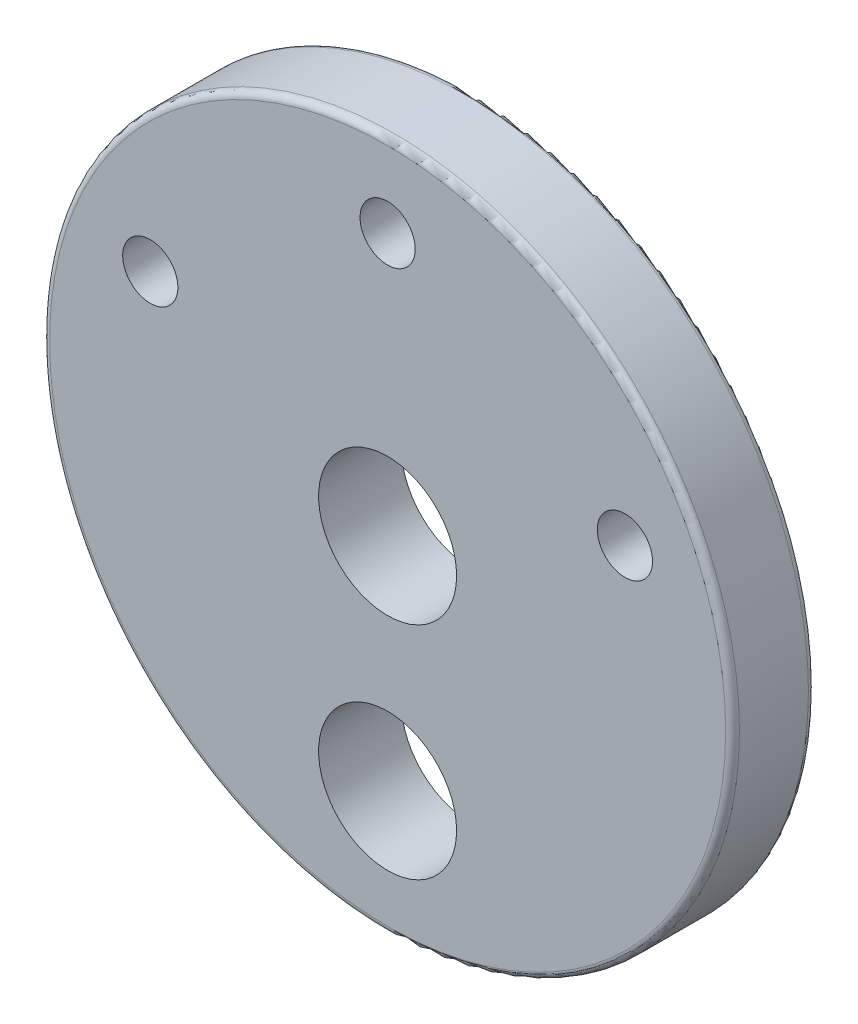
ISO-10303-21;
HEADER;
FILE_DESCRIPTION(('STEP AP214'),'2;1');
FILE_NAME('part.step','',(''),(''),'','','');
FILE_SCHEMA(('AUTOMOTIVE_DESIGN { 1 0 10303 214 1 1 1 1 }'));
ENDSEC;
DATA;
#1=APPLICATION_CONTEXT('core data for automotive mechanical design processes');
#2=APPLICATION_PROTOCOL_DEFINITION('international standard','automotive_design',2000,#1);
#3=PRODUCT_CONTEXT('',#1,'mechanical');
#4=PRODUCT('Part','Part','',(#3));
#5=PRODUCT_RELATED_PRODUCT_CATEGORY('part','',(#4));
#6=PRODUCT_DEFINITION_FORMATION('','',#4);
#7=PRODUCT_DEFINITION_CONTEXT('part definition',#1,'design');
#8=PRODUCT_DEFINITION('design','',#6,#7);
#9=PRODUCT_DEFINITION_SHAPE('','',#8);
#10=(LENGTH_UNIT() NAMED_UNIT(*) SI_UNIT(.MILLI.,.METRE.));
#11=(NAMED_UNIT(*) PLANE_ANGLE_UNIT() SI_UNIT($,.RADIAN.));
#12=(NAMED_UNIT(*) SI_UNIT($,.STERADIAN.) SOLID_ANGLE_UNIT());
#13=UNCERTAINTY_MEASURE_WITH_UNIT(LENGTH_MEASURE(1.E-05),#10,'distance_accuracy_value','');
#14=(GEOMETRIC_REPRESENTATION_CONTEXT(3) GLOBAL_UNCERTAINTY_ASSIGNED_CONTEXT((#13)) GLOBAL_UNIT_ASSIGNED_CONTEXT((#10,
#11,#12)) REPRESENTATION_CONTEXT('',''));
#15=CARTESIAN_POINT('',(0.,0.,0.));
#16=DIRECTION('',(0.,0.,1.));
#17=DIRECTION('',(1.,0.,0.));
#18=AXIS2_PLACEMENT_3D('',#15,#16,#17);
#19=CARTESIAN_POINT('',(0.,0.,3.));
#20=DIRECTION('',(0.,0.,-1.));
#21=DIRECTION('',(-1.,0.,0.));
#22=AXIS2_PLACEMENT_3D('',#19,#20,#21);
#23=CYLINDRICAL_SURFACE('',#22,12.5);
#24=CARTESIAN_POINT('',(0.,0.,0.25));
#25=DIRECTION('',(0.,0.,1.));
#26=DIRECTION('',(1.,0.,0.));
#27=AXIS2_PLACEMENT_3D('',#24,#25,#26);
#28=CIRCLE('',#27,12.5);
#29=CARTESIAN_POINT('',(12.5,0.,0.25));
#30=VERTEX_POINT('',#29);
#31=EDGE_CURVE('E43',#30,#30,#28,.T.);
#32=ORIENTED_EDGE('',*,*,#31,.T.);
#33=EDGE_LOOP('',(#32));
#34=FACE_BOUND('',#33,.T.);
#35=CARTESIAN_POINT('',(0.,0.,2.75));
#36=DIRECTION('',(0.,0.,1.));
#37=DIRECTION('',(1.,0.,0.));
#38=AXIS2_PLACEMENT_3D('',#35,#36,#37);
#39=CIRCLE('',#38,12.5);
#40=CARTESIAN_POINT('',(12.5,0.,2.75));
#41=VERTEX_POINT('',#40);
#42=EDGE_CURVE('E47',#41,#41,#39,.F.);
#43=ORIENTED_EDGE('',*,*,#42,.T.);
#44=EDGE_LOOP('',(#43));
#45=FACE_BOUND('',#44,.T.);
#46=ADVANCED_FACE('F32',(#34,#45),#23,.T.);
#47=CARTESIAN_POINT('',(0.,0.,3.));
#48=DIRECTION('',(0.,0.,1.));
#49=DIRECTION('',(1.,0.,0.));
#50=AXIS2_PLACEMENT_3D('',#47,#48,#49);
#51=PLANE('',#50);
#52=CARTESIAN_POINT('',(0.,0.,3.));
#53=DIRECTION('',(0.,0.,1.));
#54=DIRECTION('',(1.,0.,0.));
#55=AXIS2_PLACEMENT_3D('',#52,#53,#54);
#56=CIRCLE('',#55,12.25);
#57=CARTESIAN_POINT('',(12.25,0.,3.));
#58=VERTEX_POINT('',#57);
#59=EDGE_CURVE('E10',#58,#58,#56,.T.);
#60=ORIENTED_EDGE('',*,*,#59,.T.);
#61=EDGE_LOOP('',(#60));
#62=FACE_BOUND('',#61,.T.);
#63=CARTESIAN_POINT('',(0.,-8.,3.));
#64=DIRECTION('',(0.,0.,1.));
#65=DIRECTION('',(1.,0.,0.));
#66=AXIS2_PLACEMENT_3D('',#63,#64,#65);
#67=CIRCLE('',#66,2.5);
#68=CARTESIAN_POINT('',(2.5,-8.,3.));
#69=VERTEX_POINT('',#68);
#70=EDGE_CURVE('E66',#69,#69,#67,.T.);
#71=ORIENTED_EDGE('',*,*,#70,.F.);
#72=EDGE_LOOP('',(#71));
#73=FACE_BOUND('',#72,.T.);
#74=CARTESIAN_POINT('',(0.,9.5,3.));
#75=DIRECTION('',(0.,0.,1.));
#76=DIRECTION('',(1.,0.,0.));
#77=AXIS2_PLACEMENT_3D('',#74,#75,#76);
#78=CIRCLE('',#77,1.);
#79=CARTESIAN_POINT('',(1.,9.5,3.));
#80=VERTEX_POINT('',#79);
#81=EDGE_CURVE('E59',#80,#80,#78,.T.);
#82=ORIENTED_EDGE('',*,*,#81,.F.);
#83=EDGE_LOOP('',(#82));
#84=FACE_BOUND('',#83,.T.);
#85=CARTESIAN_POINT('',(8.6,4.,3.));
#86=DIRECTION('',(0.,0.,1.));
#87=DIRECTION('',(1.,0.,0.));
#88=AXIS2_PLACEMENT_3D('',#85,#86,#87);
#89=CIRCLE('',#88,1.);
#90=CARTESIAN_POINT('',(9.6,4.,3.));
#91=VERTEX_POINT('',#90);
#92=EDGE_CURVE('E77',#91,#91,#89,.T.);
#93=ORIENTED_EDGE('',*,*,#92,.F.);
#94=EDGE_LOOP('',(#93));
#95=FACE_BOUND('',#94,.T.);
#96=CARTESIAN_POINT('',(-8.6,4.,3.));
#97=DIRECTION('',(0.,0.,1.));
#98=DIRECTION('',(1.,0.,0.));
#99=AXIS2_PLACEMENT_3D('',#96,#97,#98);
#100=CIRCLE('',#99,1.);
#101=CARTESIAN_POINT('',(-7.6,4.,3.));
#102=VERTEX_POINT('',#101);
#103=EDGE_CURVE('E71',#102,#102,#100,.T.);
#104=ORIENTED_EDGE('',*,*,#103,.F.);
#105=EDGE_LOOP('',(#104));
#106=FACE_BOUND('',#105,.T.);
#107=CARTESIAN_POINT('',(0.,0.,3.));
#108=DIRECTION('',(0.,0.,1.));
#109=DIRECTION('',(1.,0.,0.));
#110=AXIS2_PLACEMENT_3D('',#107,#108,#109);
#111=CIRCLE('',#110,2.5);
#112=CARTESIAN_POINT('',(2.5,0.,3.));
#113=VERTEX_POINT('',#112);
#114=EDGE_CURVE('E53',#113,#113,#111,.T.);
#115=ORIENTED_EDGE('',*,*,#114,.F.);
#116=EDGE_LOOP('',(#115));
#117=FACE_BOUND('',#116,.T.);
#118=ADVANCED_FACE('F94',(#62,#73,#84,#95,#106,#117),#51,.T.);
#119=CARTESIAN_POINT('',(0.,0.,0.));
#120=DIRECTION('',(0.,0.,1.));
#121=DIRECTION('',(1.,0.,0.));
#122=AXIS2_PLACEMENT_3D('',#119,#120,#121);
#123=PLANE('',#122);
#124=CARTESIAN_POINT('',(0.,0.,0.));
#125=DIRECTION('',(0.,0.,1.));
#126=DIRECTION('',(1.,0.,0.));
#127=AXIS2_PLACEMENT_3D('',#124,#125,#126);
#128=CIRCLE('',#127,12.25);
#129=CARTESIAN_POINT('',(12.25,0.,0.));
#130=VERTEX_POINT('',#129);
#131=EDGE_CURVE('E39',#130,#130,#128,.F.);
#132=ORIENTED_EDGE('',*,*,#131,.T.);
#133=EDGE_LOOP('',(#132));
#134=FACE_BOUND('',#133,.T.);
#135=CARTESIAN_POINT('',(0.,-8.,0.));
#136=DIRECTION('',(0.,0.,1.));
#137=DIRECTION('',(1.,0.,0.));
#138=AXIS2_PLACEMENT_3D('',#135,#136,#137);
#139=CIRCLE('',#138,2.5);
#140=CARTESIAN_POINT('',(2.5,-8.,0.));
#141=VERTEX_POINT('',#140);
#142=EDGE_CURVE('E56',#141,#141,#139,.T.);
#143=ORIENTED_EDGE('',*,*,#142,.T.);
#144=EDGE_LOOP('',(#143));
#145=FACE_BOUND('',#144,.T.);
#146=CARTESIAN_POINT('',(0.,9.5,0.));
#147=DIRECTION('',(0.,0.,1.));
#148=DIRECTION('',(1.,0.,0.));
#149=AXIS2_PLACEMENT_3D('',#146,#147,#148);
#150=CIRCLE('',#149,1.);
#151=CARTESIAN_POINT('',(1.,9.5,0.));
#152=VERTEX_POINT('',#151);
#153=EDGE_CURVE('E62',#152,#152,#150,.T.);
#154=ORIENTED_EDGE('',*,*,#153,.T.);
#155=EDGE_LOOP('',(#154));
#156=FACE_BOUND('',#155,.T.);
#157=CARTESIAN_POINT('',(8.6,4.,0.));
#158=DIRECTION('',(0.,0.,1.));
#159=DIRECTION('',(1.,0.,0.));
#160=AXIS2_PLACEMENT_3D('',#157,#158,#159);
#161=CIRCLE('',#160,1.);
#162=CARTESIAN_POINT('',(9.6,4.,0.));
#163=VERTEX_POINT('',#162);
#164=EDGE_CURVE('E63',#163,#163,#161,.T.);
#165=ORIENTED_EDGE('',*,*,#164,.T.);
#166=EDGE_LOOP('',(#165));
#167=FACE_BOUND('',#166,.T.);
#168=CARTESIAN_POINT('',(-8.6,4.,0.));
#169=DIRECTION('',(0.,0.,1.));
#170=DIRECTION('',(1.,0.,0.));
#171=AXIS2_PLACEMENT_3D('',#168,#169,#170);
#172=CIRCLE('',#171,1.);
#173=CARTESIAN_POINT('',(-7.6,4.,0.));
#174=VERTEX_POINT('',#173);
#175=EDGE_CURVE('E74',#174,#174,#172,.T.);
#176=ORIENTED_EDGE('',*,*,#175,.T.);
#177=EDGE_LOOP('',(#176));
#178=FACE_BOUND('',#177,.T.);
#179=CARTESIAN_POINT('',(0.,0.,0.));
#180=DIRECTION('',(0.,0.,1.));
#181=DIRECTION('',(1.,0.,0.));
#182=AXIS2_PLACEMENT_3D('',#179,#180,#181);
#183=CIRCLE('',#182,2.5);
#184=CARTESIAN_POINT('',(2.5,0.,0.));
#185=VERTEX_POINT('',#184);
#186=EDGE_CURVE('E52',#185,#185,#183,.T.);
#187=ORIENTED_EDGE('',*,*,#186,.T.);
#188=EDGE_LOOP('',(#187));
#189=FACE_BOUND('',#188,.T.);
#190=ADVANCED_FACE('F83',(#134,#145,#156,#167,#178,#189),#123,.F.);
#191=CARTESIAN_POINT('',(0.,0.,0.));
#192=DIRECTION('',(0.,0.,1.));
#193=DIRECTION('',(1.,0.,0.));
#194=AXIS2_PLACEMENT_3D('',#191,#192,#193);
#195=CYLINDRICAL_SURFACE('',#194,2.5);
#196=ORIENTED_EDGE('',*,*,#186,.F.);
#197=EDGE_LOOP('',(#196));
#198=FACE_BOUND('',#197,.T.);
#199=ORIENTED_EDGE('',*,*,#114,.T.);
#200=EDGE_LOOP('',(#199));
#201=FACE_BOUND('',#200,.T.);
#202=ADVANCED_FACE('F102',(#198,#201),#195,.F.);
#203=CARTESIAN_POINT('',(-8.6,4.,0.));
#204=DIRECTION('',(0.,0.,1.));
#205=DIRECTION('',(1.,0.,0.));
#206=AXIS2_PLACEMENT_3D('',#203,#204,#205);
#207=CYLINDRICAL_SURFACE('',#206,1.);
#208=ORIENTED_EDGE('',*,*,#175,.F.);
#209=EDGE_LOOP('',(#208));
#210=FACE_BOUND('',#209,.T.);
#211=ORIENTED_EDGE('',*,*,#103,.T.);
#212=EDGE_LOOP('',(#211));
#213=FACE_BOUND('',#212,.T.);
#214=ADVANCED_FACE('F90',(#210,#213),#207,.F.);
#215=CARTESIAN_POINT('',(8.6,4.,0.));
#216=DIRECTION('',(0.,0.,1.));
#217=DIRECTION('',(1.,0.,0.));
#218=AXIS2_PLACEMENT_3D('',#215,#216,#217);
#219=CYLINDRICAL_SURFACE('',#218,1.);
#220=ORIENTED_EDGE('',*,*,#164,.F.);
#221=EDGE_LOOP('',(#220));
#222=FACE_BOUND('',#221,.T.);
#223=ORIENTED_EDGE('',*,*,#92,.T.);
#224=EDGE_LOOP('',(#223));
#225=FACE_BOUND('',#224,.T.);
#226=ADVANCED_FACE('F86',(#222,#225),#219,.F.);
#227=CARTESIAN_POINT('',(0.,9.5,0.));
#228=DIRECTION('',(0.,0.,1.));
#229=DIRECTION('',(1.,0.,0.));
#230=AXIS2_PLACEMENT_3D('',#227,#228,#229);
#231=CYLINDRICAL_SURFACE('',#230,1.);
#232=ORIENTED_EDGE('',*,*,#153,.F.);
#233=EDGE_LOOP('',(#232));
#234=FACE_BOUND('',#233,.T.);
#235=ORIENTED_EDGE('',*,*,#81,.T.);
#236=EDGE_LOOP('',(#235));
#237=FACE_BOUND('',#236,.T.);
#238=ADVANCED_FACE('F89',(#234,#237),#231,.F.);
#239=CARTESIAN_POINT('',(0.,-8.,0.));
#240=DIRECTION('',(0.,0.,1.));
#241=DIRECTION('',(1.,0.,0.));
#242=AXIS2_PLACEMENT_3D('',#239,#240,#241);
#243=CYLINDRICAL_SURFACE('',#242,2.5);
#244=ORIENTED_EDGE('',*,*,#142,.F.);
#245=EDGE_LOOP('',(#244));
#246=FACE_BOUND('',#245,.T.);
#247=ORIENTED_EDGE('',*,*,#70,.T.);
#248=EDGE_LOOP('',(#247));
#249=FACE_BOUND('',#248,.T.);
#250=ADVANCED_FACE('F123',(#246,#249),#243,.F.);
#251=CARTESIAN_POINT('',(0.,0.,0.25));
#252=DIRECTION('',(0.,0.,1.));
#253=DIRECTION('',(1.,0.,0.));
#254=AXIS2_PLACEMENT_3D('',#251,#252,#253);
#255=TOROIDAL_SURFACE('',#254,12.25,0.25);
#256=ORIENTED_EDGE('',*,*,#131,.F.);
#257=EDGE_LOOP('',(#256));
#258=FACE_BOUND('',#257,.T.);
#259=ORIENTED_EDGE('',*,*,#31,.F.);
#260=EDGE_LOOP('',(#259));
#261=FACE_BOUND('',#260,.T.);
#262=ADVANCED_FACE('F121',(#258,#261),#255,.T.);
#263=CARTESIAN_POINT('',(0.,0.,2.75));
#264=DIRECTION('',(0.,0.,1.));
#265=DIRECTION('',(1.,0.,0.));
#266=AXIS2_PLACEMENT_3D('',#263,#264,#265);
#267=TOROIDAL_SURFACE('',#266,12.25,0.25);
#268=ORIENTED_EDGE('',*,*,#42,.F.);
#269=EDGE_LOOP('',(#268));
#270=FACE_BOUND('',#269,.T.);
#271=ORIENTED_EDGE('',*,*,#59,.F.);
#272=EDGE_LOOP('',(#271));
#273=FACE_BOUND('',#272,.T.);
#274=ADVANCED_FACE('F34',(#270,#273),#267,.T.);
#275=CLOSED_SHELL('',(#46,#118,#190,#202,#214,#226,#238,#250,#262,#274));
#276=MANIFOLD_SOLID_BREP('B2',#275);
#277=ADVANCED_BREP_SHAPE_REPRESENTATION('',(#18,#276),#14);
#278=SHAPE_DEFINITION_REPRESENTATION(#9,#277);
ENDSEC;
END-ISO-10303-21;
